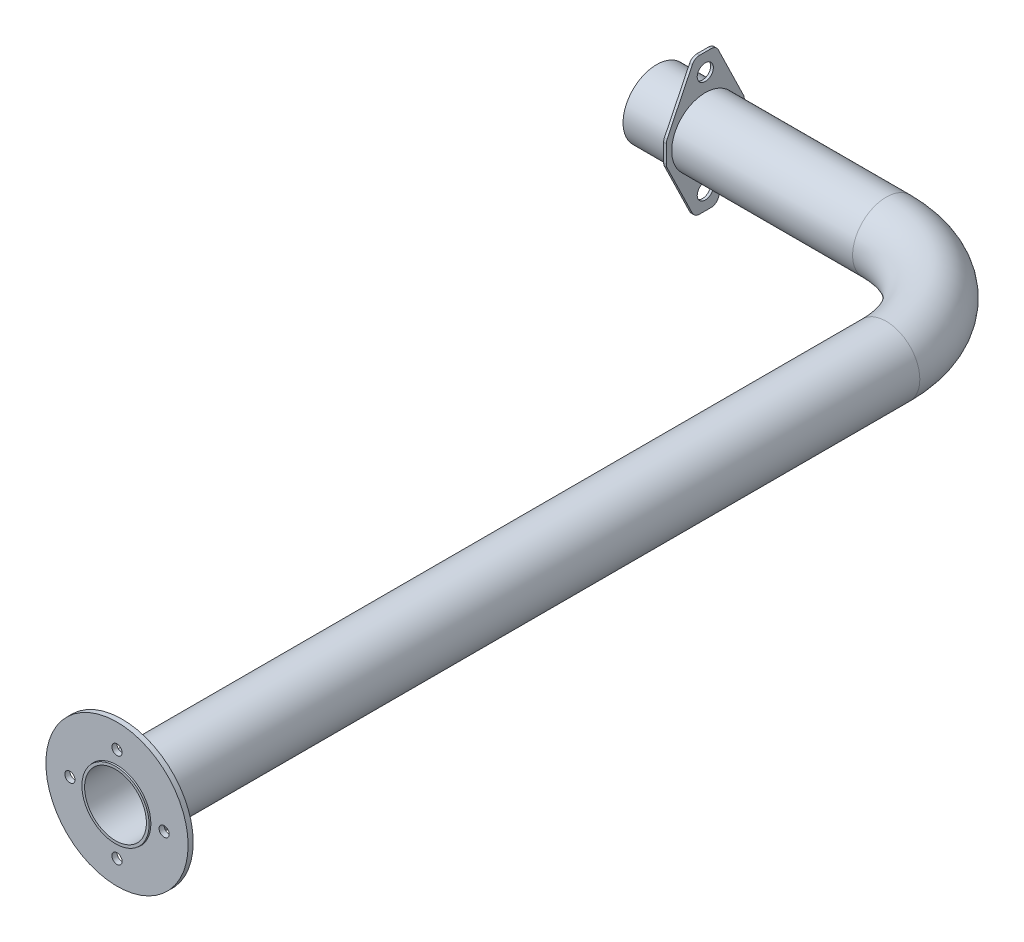
ISO-10303-21;
HEADER;
FILE_DESCRIPTION(('STEP AP214'),'2;1');
FILE_NAME('part.step','',(''),(''),'','','');
FILE_SCHEMA(('AUTOMOTIVE_DESIGN { 1 0 10303 214 1 1 1 1 }'));
ENDSEC;
DATA;
#1=APPLICATION_CONTEXT('core data for automotive mechanical design processes');
#2=APPLICATION_PROTOCOL_DEFINITION('international standard','automotive_design',2000,#1);
#3=PRODUCT_CONTEXT('',#1,'mechanical');
#4=PRODUCT('Part','Part','',(#3));
#5=PRODUCT_RELATED_PRODUCT_CATEGORY('part','',(#4));
#6=PRODUCT_DEFINITION_FORMATION('','',#4);
#7=PRODUCT_DEFINITION_CONTEXT('part definition',#1,'design');
#8=PRODUCT_DEFINITION('design','',#6,#7);
#9=PRODUCT_DEFINITION_SHAPE('','',#8);
#10=(LENGTH_UNIT() NAMED_UNIT(*) SI_UNIT(.MILLI.,.METRE.));
#11=(NAMED_UNIT(*) PLANE_ANGLE_UNIT() SI_UNIT($,.RADIAN.));
#12=(NAMED_UNIT(*) SI_UNIT($,.STERADIAN.) SOLID_ANGLE_UNIT());
#13=UNCERTAINTY_MEASURE_WITH_UNIT(LENGTH_MEASURE(1.E-05),#10,'distance_accuracy_value','');
#14=(GEOMETRIC_REPRESENTATION_CONTEXT(3) GLOBAL_UNCERTAINTY_ASSIGNED_CONTEXT((#13)) GLOBAL_UNIT_ASSIGNED_CONTEXT((#10,
#11,#12)) REPRESENTATION_CONTEXT('',''));
#15=CARTESIAN_POINT('',(0.,0.,0.));
#16=DIRECTION('',(0.,0.,1.));
#17=DIRECTION('',(1.,0.,0.));
#18=AXIS2_PLACEMENT_3D('',#15,#16,#17);
#19=CARTESIAN_POINT('',(-107.3,0.,-341.2));
#20=DIRECTION('',(0.,0.,1.));
#21=DIRECTION('',(1.,0.,0.));
#22=AXIS2_PLACEMENT_3D('',#19,#20,#21);
#23=PLANE('',#22);
#24=DIRECTION('',(0.,1.,0.));
#25=VECTOR('',#24,1.);
#26=CARTESIAN_POINT('',(-108.3,0.,-341.2));
#27=LINE('',#26,#25);
#28=CARTESIAN_POINT('',(-108.3,-3.30946597955697,-341.2));
#29=VERTEX_POINT('',#28);
#30=CARTESIAN_POINT('',(-108.3,3.30946597955698,-341.2));
#31=VERTEX_POINT('',#30);
#32=EDGE_CURVE('E209',#29,#31,#27,.T.);
#33=ORIENTED_EDGE('',*,*,#32,.T.);
#34=DIRECTION('',(-1.,0.,0.));
#35=VECTOR('',#34,1.);
#36=CARTESIAN_POINT('',(-107.3,3.30946597955698,-341.2));
#37=LINE('',#36,#35);
#38=CARTESIAN_POINT('',(-107.3,3.30946597955698,-341.2));
#39=VERTEX_POINT('',#38);
#40=EDGE_CURVE('E12',#39,#31,#37,.T.);
#41=ORIENTED_EDGE('',*,*,#40,.F.);
#42=DIRECTION('',(0.,1.,0.));
#43=VECTOR('',#42,1.);
#44=CARTESIAN_POINT('',(-107.3,0.,-341.2));
#45=LINE('',#44,#43);
#46=CARTESIAN_POINT('',(-107.3,-3.30946597955697,-341.2));
#47=VERTEX_POINT('',#46);
#48=EDGE_CURVE('E135',#47,#39,#45,.T.);
#49=ORIENTED_EDGE('',*,*,#48,.F.);
#50=DIRECTION('',(-1.,0.,0.));
#51=VECTOR('',#50,1.);
#52=CARTESIAN_POINT('',(-107.3,-3.30946597955697,-341.2));
#53=LINE('',#52,#51);
#54=EDGE_CURVE('E208',#47,#29,#53,.T.);
#55=ORIENTED_EDGE('',*,*,#54,.T.);
#56=EDGE_LOOP('',(#33,#41,#49,#55));
#57=FACE_BOUND('',#56,.T.);
#58=ADVANCED_FACE('F55',(#57),#23,.F.);
#59=CARTESIAN_POINT('',(-107.3,3.30946597955699,-338.2));
#60=DIRECTION('',(-1.,0.,0.));
#61=DIRECTION('',(0.,0.,1.));
#62=AXIS2_PLACEMENT_3D('',#59,#60,#61);
#63=CYLINDRICAL_SURFACE('',#62,3.);
#64=CARTESIAN_POINT('',(-108.3,3.30946597955699,-338.2));
#65=DIRECTION('',(1.,0.,0.));
#66=DIRECTION('',(0.,0.,-1.));
#67=AXIS2_PLACEMENT_3D('',#64,#65,#66);
#68=CIRCLE('',#67,3.);
#69=CARTESIAN_POINT('',(-108.3,4.6210441001753,-340.898103562415));
#70=VERTEX_POINT('',#69);
#71=EDGE_CURVE('E212',#70,#31,#68,.F.);
#72=ORIENTED_EDGE('',*,*,#71,.F.);
#73=DIRECTION('',(-1.,0.,0.));
#74=VECTOR('',#73,1.);
#75=CARTESIAN_POINT('',(-107.3,4.6210441001753,-340.898103562415));
#76=LINE('',#75,#74);
#77=CARTESIAN_POINT('',(-107.3,4.6210441001753,-340.898103562415));
#78=VERTEX_POINT('',#77);
#79=EDGE_CURVE('E63',#78,#70,#76,.T.);
#80=ORIENTED_EDGE('',*,*,#79,.F.);
#81=CARTESIAN_POINT('',(-107.3,3.30946597955699,-338.2));
#82=DIRECTION('',(1.,0.,0.));
#83=DIRECTION('',(0.,0.,-1.));
#84=AXIS2_PLACEMENT_3D('',#81,#82,#83);
#85=CIRCLE('',#84,3.);
#86=EDGE_CURVE('E305',#78,#39,#85,.F.);
#87=ORIENTED_EDGE('',*,*,#86,.T.);
#88=ORIENTED_EDGE('',*,*,#40,.T.);
#89=EDGE_LOOP('',(#72,#80,#87,#88));
#90=FACE_BOUND('',#89,.T.);
#91=ADVANCED_FACE('F290',(#90),#63,.T.);
#92=CARTESIAN_POINT('',(-107.3,134.923388984241,-277.556685910438));
#93=DIRECTION('',(0.,0.437192706872768,-0.899367854138262));
#94=DIRECTION('',(0.,0.899367854138262,0.437192706872768));
#95=AXIS2_PLACEMENT_3D('',#92,#93,#94);
#96=PLANE('',#95);
#97=DIRECTION('',(0.,-0.899367854138262,-0.437192706872768));
#98=VECTOR('',#97,1.);
#99=CARTESIAN_POINT('',(-108.3,134.923388984241,-277.556685910438));
#100=LINE('',#99,#98);
#101=CARTESIAN_POINT('',(-108.3,23.9115781206183,-331.520760635811));
#102=VERTEX_POINT('',#101);
#103=EDGE_CURVE('E215',#102,#70,#100,.T.);
#104=ORIENTED_EDGE('',*,*,#103,.F.);
#105=DIRECTION('',(-1.,0.,0.));
#106=VECTOR('',#105,1.);
#107=CARTESIAN_POINT('',(-107.3,23.9115781206183,-331.520760635811));
#108=LINE('',#107,#106);
#109=CARTESIAN_POINT('',(-107.3,23.9115781206183,-331.520760635811));
#110=VERTEX_POINT('',#109);
#111=EDGE_CURVE('E280',#110,#102,#108,.T.);
#112=ORIENTED_EDGE('',*,*,#111,.F.);
#113=DIRECTION('',(0.,-0.899367854138262,-0.437192706872768));
#114=VECTOR('',#113,1.);
#115=CARTESIAN_POINT('',(-107.3,134.923388984241,-277.556685910438));
#116=LINE('',#115,#114);
#117=EDGE_CURVE('E287',#110,#78,#116,.T.);
#118=ORIENTED_EDGE('',*,*,#117,.T.);
#119=ORIENTED_EDGE('',*,*,#79,.T.);
#120=EDGE_LOOP('',(#104,#112,#118,#119));
#121=FACE_BOUND('',#120,.T.);
#122=ADVANCED_FACE('F285',(#121),#96,.T.);
#123=CARTESIAN_POINT('',(-107.3,22.6,-328.822657073396));
#124=DIRECTION('',(-1.,0.,0.));
#125=DIRECTION('',(0.,0.,1.));
#126=AXIS2_PLACEMENT_3D('',#123,#124,#125);
#127=CYLINDRICAL_SURFACE('',#126,3.);
#128=CARTESIAN_POINT('',(-108.3,22.6,-328.822657073396));
#129=DIRECTION('',(1.,0.,0.));
#130=DIRECTION('',(0.,0.,-1.));
#131=AXIS2_PLACEMENT_3D('',#128,#129,#130);
#132=CIRCLE('',#131,3.);
#133=CARTESIAN_POINT('',(-108.3,25.6,-328.822657073396));
#134=VERTEX_POINT('',#133);
#135=EDGE_CURVE('E218',#134,#102,#132,.F.);
#136=ORIENTED_EDGE('',*,*,#135,.F.);
#137=DIRECTION('',(-1.,0.,0.));
#138=VECTOR('',#137,1.);
#139=CARTESIAN_POINT('',(-107.3,25.6,-328.822657073396));
#140=LINE('',#139,#138);
#141=CARTESIAN_POINT('',(-107.3,25.6,-328.822657073396));
#142=VERTEX_POINT('',#141);
#143=EDGE_CURVE('E278',#142,#134,#140,.T.);
#144=ORIENTED_EDGE('',*,*,#143,.F.);
#145=CARTESIAN_POINT('',(-107.3,22.6,-328.822657073396));
#146=DIRECTION('',(1.,0.,0.));
#147=DIRECTION('',(0.,0.,-1.));
#148=AXIS2_PLACEMENT_3D('',#145,#146,#147);
#149=CIRCLE('',#148,3.);
#150=EDGE_CURVE('E302',#142,#110,#149,.F.);
#151=ORIENTED_EDGE('',*,*,#150,.T.);
#152=ORIENTED_EDGE('',*,*,#111,.T.);
#153=EDGE_LOOP('',(#136,#144,#151,#152));
#154=FACE_BOUND('',#153,.T.);
#155=ADVANCED_FACE('F299',(#154),#127,.T.);
#156=CARTESIAN_POINT('',(-107.3,25.6,0.));
#157=DIRECTION('',(0.,1.,0.));
#158=DIRECTION('',(0.,0.,1.));
#159=AXIS2_PLACEMENT_3D('',#156,#157,#158);
#160=PLANE('',#159);
#161=DIRECTION('',(0.,0.,-1.));
#162=VECTOR('',#161,1.);
#163=CARTESIAN_POINT('',(-108.3,25.6,0.));
#164=LINE('',#163,#162);
#165=CARTESIAN_POINT('',(-108.3,25.6,-324.577342926604));
#166=VERTEX_POINT('',#165);
#167=EDGE_CURVE('E221',#166,#134,#164,.T.);
#168=ORIENTED_EDGE('',*,*,#167,.F.);
#169=DIRECTION('',(-1.,0.,0.));
#170=VECTOR('',#169,1.);
#171=CARTESIAN_POINT('',(-107.3,25.6,-324.577342926604));
#172=LINE('',#171,#170);
#173=CARTESIAN_POINT('',(-107.3,25.6,-324.577342926604));
#174=VERTEX_POINT('',#173);
#175=EDGE_CURVE('E276',#174,#166,#172,.T.);
#176=ORIENTED_EDGE('',*,*,#175,.F.);
#177=DIRECTION('',(0.,0.,-1.));
#178=VECTOR('',#177,1.);
#179=CARTESIAN_POINT('',(-107.3,25.6,0.));
#180=LINE('',#179,#178);
#181=EDGE_CURVE('E307',#174,#142,#180,.T.);
#182=ORIENTED_EDGE('',*,*,#181,.T.);
#183=ORIENTED_EDGE('',*,*,#143,.T.);
#184=EDGE_LOOP('',(#168,#176,#182,#183));
#185=FACE_BOUND('',#184,.T.);
#186=ADVANCED_FACE('F520',(#185),#160,.T.);
#187=CARTESIAN_POINT('',(-107.3,22.6,-324.577342926604));
#188=DIRECTION('',(-1.,0.,0.));
#189=DIRECTION('',(0.,0.,1.));
#190=AXIS2_PLACEMENT_3D('',#187,#188,#189);
#191=CYLINDRICAL_SURFACE('',#190,3.);
#192=CARTESIAN_POINT('',(-108.3,22.6,-324.577342926604));
#193=DIRECTION('',(1.,0.,0.));
#194=DIRECTION('',(0.,0.,-1.));
#195=AXIS2_PLACEMENT_3D('',#192,#193,#194);
#196=CIRCLE('',#195,3.);
#197=CARTESIAN_POINT('',(-108.3,23.9115781206183,-321.87923936419));
#198=VERTEX_POINT('',#197);
#199=EDGE_CURVE('E224',#166,#198,#196,.T.);
#200=ORIENTED_EDGE('',*,*,#199,.T.);
#201=DIRECTION('',(-1.,0.,0.));
#202=VECTOR('',#201,1.);
#203=CARTESIAN_POINT('',(-107.3,23.9115781206183,-321.87923936419));
#204=LINE('',#203,#202);
#205=CARTESIAN_POINT('',(-107.3,23.9115781206183,-321.87923936419));
#206=VERTEX_POINT('',#205);
#207=EDGE_CURVE('E273',#206,#198,#204,.T.);
#208=ORIENTED_EDGE('',*,*,#207,.F.);
#209=CARTESIAN_POINT('',(-107.3,22.6,-324.577342926604));
#210=DIRECTION('',(1.,0.,0.));
#211=DIRECTION('',(0.,0.,-1.));
#212=AXIS2_PLACEMENT_3D('',#209,#210,#211);
#213=CIRCLE('',#212,3.);
#214=EDGE_CURVE('E313',#174,#206,#213,.T.);
#215=ORIENTED_EDGE('',*,*,#214,.F.);
#216=ORIENTED_EDGE('',*,*,#175,.T.);
#217=EDGE_LOOP('',(#200,#208,#215,#216));
#218=FACE_BOUND('',#217,.T.);
#219=ADVANCED_FACE('F509',(#218),#191,.T.);
#220=CARTESIAN_POINT('',(-107.3,-121.991574348573,-250.954095802777));
#221=DIRECTION('',(0.,-0.437192706872768,-0.899367854138262));
#222=DIRECTION('',(0.,0.899367854138262,-0.437192706872768));
#223=AXIS2_PLACEMENT_3D('',#220,#221,#222);
#224=PLANE('',#223);
#225=DIRECTION('',(0.,-0.899367854138262,0.437192706872768));
#226=VECTOR('',#225,1.);
#227=CARTESIAN_POINT('',(-108.3,-121.991574348573,-250.954095802777));
#228=LINE('',#227,#226);
#229=CARTESIAN_POINT('',(-108.3,4.6210441001753,-312.501896437585));
#230=VERTEX_POINT('',#229);
#231=EDGE_CURVE('E226',#198,#230,#228,.T.);
#232=ORIENTED_EDGE('',*,*,#231,.T.);
#233=DIRECTION('',(-1.,0.,0.));
#234=VECTOR('',#233,1.);
#235=CARTESIAN_POINT('',(-107.3,4.6210441001753,-312.501896437585));
#236=LINE('',#235,#234);
#237=CARTESIAN_POINT('',(-107.3,4.6210441001753,-312.501896437585));
#238=VERTEX_POINT('',#237);
#239=EDGE_CURVE('E270',#238,#230,#236,.T.);
#240=ORIENTED_EDGE('',*,*,#239,.F.);
#241=DIRECTION('',(0.,-0.899367854138262,0.437192706872768));
#242=VECTOR('',#241,1.);
#243=CARTESIAN_POINT('',(-107.3,-121.991574348573,-250.954095802777));
#244=LINE('',#243,#242);
#245=EDGE_CURVE('E315',#206,#238,#244,.T.);
#246=ORIENTED_EDGE('',*,*,#245,.F.);
#247=ORIENTED_EDGE('',*,*,#207,.T.);
#248=EDGE_LOOP('',(#232,#240,#246,#247));
#249=FACE_BOUND('',#248,.T.);
#250=ADVANCED_FACE('F498',(#249),#224,.F.);
#251=CARTESIAN_POINT('',(-107.3,3.30946597955699,-315.2));
#252=DIRECTION('',(-1.,0.,0.));
#253=DIRECTION('',(0.,0.,1.));
#254=AXIS2_PLACEMENT_3D('',#251,#252,#253);
#255=CYLINDRICAL_SURFACE('',#254,3.);
#256=CARTESIAN_POINT('',(-108.3,3.30946597955699,-315.2));
#257=DIRECTION('',(1.,0.,0.));
#258=DIRECTION('',(0.,0.,-1.));
#259=AXIS2_PLACEMENT_3D('',#256,#257,#258);
#260=CIRCLE('',#259,3.);
#261=CARTESIAN_POINT('',(-108.3,3.30946597955698,-312.2));
#262=VERTEX_POINT('',#261);
#263=EDGE_CURVE('E228',#230,#262,#260,.T.);
#264=ORIENTED_EDGE('',*,*,#263,.T.);
#265=DIRECTION('',(-1.,0.,0.));
#266=VECTOR('',#265,1.);
#267=CARTESIAN_POINT('',(-107.3,3.30946597955698,-312.2));
#268=LINE('',#267,#266);
#269=CARTESIAN_POINT('',(-107.3,3.30946597955698,-312.2));
#270=VERTEX_POINT('',#269);
#271=EDGE_CURVE('E268',#270,#262,#268,.T.);
#272=ORIENTED_EDGE('',*,*,#271,.F.);
#273=CARTESIAN_POINT('',(-107.3,3.30946597955699,-315.2));
#274=DIRECTION('',(1.,0.,0.));
#275=DIRECTION('',(0.,0.,-1.));
#276=AXIS2_PLACEMENT_3D('',#273,#274,#275);
#277=CIRCLE('',#276,3.);
#278=EDGE_CURVE('E317',#238,#270,#277,.T.);
#279=ORIENTED_EDGE('',*,*,#278,.F.);
#280=ORIENTED_EDGE('',*,*,#239,.T.);
#281=EDGE_LOOP('',(#264,#272,#279,#280));
#282=FACE_BOUND('',#281,.T.);
#283=ADVANCED_FACE('F487',(#282),#255,.T.);
#284=CARTESIAN_POINT('',(-107.3,0.,-312.2));
#285=DIRECTION('',(0.,0.,1.));
#286=DIRECTION('',(1.,0.,0.));
#287=AXIS2_PLACEMENT_3D('',#284,#285,#286);
#288=PLANE('',#287);
#289=DIRECTION('',(0.,1.,0.));
#290=VECTOR('',#289,1.);
#291=CARTESIAN_POINT('',(-108.3,0.,-312.2));
#292=LINE('',#291,#290);
#293=CARTESIAN_POINT('',(-108.3,-3.30946597955697,-312.2));
#294=VERTEX_POINT('',#293);
#295=EDGE_CURVE('E231',#294,#262,#292,.T.);
#296=ORIENTED_EDGE('',*,*,#295,.F.);
#297=DIRECTION('',(-1.,0.,0.));
#298=VECTOR('',#297,1.);
#299=CARTESIAN_POINT('',(-107.3,-3.30946597955697,-312.2));
#300=LINE('',#299,#298);
#301=CARTESIAN_POINT('',(-107.3,-3.30946597955697,-312.2));
#302=VERTEX_POINT('',#301);
#303=EDGE_CURVE('E266',#302,#294,#300,.T.);
#304=ORIENTED_EDGE('',*,*,#303,.F.);
#305=DIRECTION('',(0.,1.,0.));
#306=VECTOR('',#305,1.);
#307=CARTESIAN_POINT('',(-107.3,0.,-312.2));
#308=LINE('',#307,#306);
#309=EDGE_CURVE('E319',#302,#270,#308,.T.);
#310=ORIENTED_EDGE('',*,*,#309,.T.);
#311=ORIENTED_EDGE('',*,*,#271,.T.);
#312=EDGE_LOOP('',(#296,#304,#310,#311));
#313=FACE_BOUND('',#312,.T.);
#314=ADVANCED_FACE('F476',(#313),#288,.T.);
#315=CARTESIAN_POINT('',(-107.3,-3.30946597955699,-315.2));
#316=DIRECTION('',(-1.,0.,0.));
#317=DIRECTION('',(0.,0.,1.));
#318=AXIS2_PLACEMENT_3D('',#315,#316,#317);
#319=CYLINDRICAL_SURFACE('',#318,3.00000000000003);
#320=CARTESIAN_POINT('',(-108.3,-3.30946597955699,-315.2));
#321=DIRECTION('',(1.,0.,0.));
#322=DIRECTION('',(0.,0.,-1.));
#323=AXIS2_PLACEMENT_3D('',#320,#321,#322);
#324=CIRCLE('',#323,3.00000000000003);
#325=CARTESIAN_POINT('',(-108.3,-4.62104410017533,-312.501896437585));
#326=VERTEX_POINT('',#325);
#327=EDGE_CURVE('E234',#326,#294,#324,.F.);
#328=ORIENTED_EDGE('',*,*,#327,.F.);
#329=DIRECTION('',(-1.,0.,0.));
#330=VECTOR('',#329,1.);
#331=CARTESIAN_POINT('',(-107.3,-4.62104410017533,-312.501896437585));
#332=LINE('',#331,#330);
#333=CARTESIAN_POINT('',(-107.3,-4.62104410017533,-312.501896437585));
#334=VERTEX_POINT('',#333);
#335=EDGE_CURVE('E264',#334,#326,#332,.T.);
#336=ORIENTED_EDGE('',*,*,#335,.F.);
#337=CARTESIAN_POINT('',(-107.3,-3.30946597955699,-315.2));
#338=DIRECTION('',(1.,0.,0.));
#339=DIRECTION('',(0.,0.,-1.));
#340=AXIS2_PLACEMENT_3D('',#337,#338,#339);
#341=CIRCLE('',#340,3.00000000000003);
#342=EDGE_CURVE('E322',#334,#302,#341,.F.);
#343=ORIENTED_EDGE('',*,*,#342,.T.);
#344=ORIENTED_EDGE('',*,*,#303,.T.);
#345=EDGE_LOOP('',(#328,#336,#343,#344));
#346=FACE_BOUND('',#345,.T.);
#347=ADVANCED_FACE('F466',(#346),#319,.T.);
#348=CARTESIAN_POINT('',(-107.3,121.991574348573,-250.954095802777));
#349=DIRECTION('',(0.,-0.437192706872768,0.899367854138262));
#350=DIRECTION('',(0.,-0.899367854138262,-0.437192706872768));
#351=AXIS2_PLACEMENT_3D('',#348,#349,#350);
#352=PLANE('',#351);
#353=DIRECTION('',(0.,0.899367854138262,0.437192706872768));
#354=VECTOR('',#353,1.);
#355=CARTESIAN_POINT('',(-108.3,121.991574348573,-250.954095802777));
#356=LINE('',#355,#354);
#357=CARTESIAN_POINT('',(-108.3,-23.9115781206183,-321.879239364189));
#358=VERTEX_POINT('',#357);
#359=EDGE_CURVE('E237',#358,#326,#356,.T.);
#360=ORIENTED_EDGE('',*,*,#359,.F.);
#361=DIRECTION('',(-1.,0.,0.));
#362=VECTOR('',#361,1.);
#363=CARTESIAN_POINT('',(-107.3,-23.9115781206183,-321.879239364189));
#364=LINE('',#363,#362);
#365=CARTESIAN_POINT('',(-107.3,-23.9115781206183,-321.879239364189));
#366=VERTEX_POINT('',#365);
#367=EDGE_CURVE('E262',#366,#358,#364,.T.);
#368=ORIENTED_EDGE('',*,*,#367,.F.);
#369=DIRECTION('',(0.,0.899367854138262,0.437192706872768));
#370=VECTOR('',#369,1.);
#371=CARTESIAN_POINT('',(-107.3,121.991574348573,-250.954095802777));
#372=LINE('',#371,#370);
#373=EDGE_CURVE('E325',#366,#334,#372,.T.);
#374=ORIENTED_EDGE('',*,*,#373,.T.);
#375=ORIENTED_EDGE('',*,*,#335,.T.);
#376=EDGE_LOOP('',(#360,#368,#374,#375));
#377=FACE_BOUND('',#376,.T.);
#378=ADVANCED_FACE('F338',(#377),#352,.T.);
#379=CARTESIAN_POINT('',(-107.3,-22.6,-324.577342926604));
#380=DIRECTION('',(-1.,0.,0.));
#381=DIRECTION('',(0.,0.,1.));
#382=AXIS2_PLACEMENT_3D('',#379,#380,#381);
#383=CYLINDRICAL_SURFACE('',#382,3.);
#384=CARTESIAN_POINT('',(-108.3,-22.6,-324.577342926604));
#385=DIRECTION('',(1.,0.,0.));
#386=DIRECTION('',(0.,0.,-1.));
#387=AXIS2_PLACEMENT_3D('',#384,#385,#386);
#388=CIRCLE('',#387,3.);
#389=CARTESIAN_POINT('',(-108.3,-25.6,-324.577342926604));
#390=VERTEX_POINT('',#389);
#391=EDGE_CURVE('E240',#390,#358,#388,.F.);
#392=ORIENTED_EDGE('',*,*,#391,.F.);
#393=DIRECTION('',(-1.,0.,0.));
#394=VECTOR('',#393,1.);
#395=CARTESIAN_POINT('',(-107.3,-25.6,-324.577342926604));
#396=LINE('',#395,#394);
#397=CARTESIAN_POINT('',(-107.3,-25.6,-324.577342926604));
#398=VERTEX_POINT('',#397);
#399=EDGE_CURVE('E260',#398,#390,#396,.T.);
#400=ORIENTED_EDGE('',*,*,#399,.F.);
#401=CARTESIAN_POINT('',(-107.3,-22.6,-324.577342926604));
#402=DIRECTION('',(1.,0.,0.));
#403=DIRECTION('',(0.,0.,-1.));
#404=AXIS2_PLACEMENT_3D('',#401,#402,#403);
#405=CIRCLE('',#404,3.);
#406=EDGE_CURVE('E328',#398,#366,#405,.F.);
#407=ORIENTED_EDGE('',*,*,#406,.T.);
#408=ORIENTED_EDGE('',*,*,#367,.T.);
#409=EDGE_LOOP('',(#392,#400,#407,#408));
#410=FACE_BOUND('',#409,.T.);
#411=ADVANCED_FACE('F332',(#410),#383,.T.);
#412=CARTESIAN_POINT('',(-107.3,-25.6,0.));
#413=DIRECTION('',(0.,1.,0.));
#414=DIRECTION('',(0.,0.,1.));
#415=AXIS2_PLACEMENT_3D('',#412,#413,#414);
#416=PLANE('',#415);
#417=DIRECTION('',(0.,0.,-1.));
#418=VECTOR('',#417,1.);
#419=CARTESIAN_POINT('',(-108.3,-25.6,0.));
#420=LINE('',#419,#418);
#421=CARTESIAN_POINT('',(-108.3,-25.6,-328.822657073396));
#422=VERTEX_POINT('',#421);
#423=EDGE_CURVE('E243',#390,#422,#420,.T.);
#424=ORIENTED_EDGE('',*,*,#423,.T.);
#425=DIRECTION('',(-1.,0.,0.));
#426=VECTOR('',#425,1.);
#427=CARTESIAN_POINT('',(-107.3,-25.6,-328.822657073396));
#428=LINE('',#427,#426);
#429=CARTESIAN_POINT('',(-107.3,-25.6,-328.822657073396));
#430=VERTEX_POINT('',#429);
#431=EDGE_CURVE('E191',#430,#422,#428,.T.);
#432=ORIENTED_EDGE('',*,*,#431,.F.);
#433=DIRECTION('',(0.,0.,-1.));
#434=VECTOR('',#433,1.);
#435=CARTESIAN_POINT('',(-107.3,-25.6,0.));
#436=LINE('',#435,#434);
#437=EDGE_CURVE('E182',#398,#430,#436,.T.);
#438=ORIENTED_EDGE('',*,*,#437,.F.);
#439=ORIENTED_EDGE('',*,*,#399,.T.);
#440=EDGE_LOOP('',(#424,#432,#438,#439));
#441=FACE_BOUND('',#440,.T.);
#442=ADVANCED_FACE('F342',(#441),#416,.F.);
#443=CARTESIAN_POINT('',(-107.3,-22.6,-328.822657073396));
#444=DIRECTION('',(-1.,0.,0.));
#445=DIRECTION('',(0.,0.,1.));
#446=AXIS2_PLACEMENT_3D('',#443,#444,#445);
#447=CYLINDRICAL_SURFACE('',#446,3.);
#448=CARTESIAN_POINT('',(-108.3,-22.6,-328.822657073396));
#449=DIRECTION('',(1.,0.,0.));
#450=DIRECTION('',(0.,0.,-1.));
#451=AXIS2_PLACEMENT_3D('',#448,#449,#450);
#452=CIRCLE('',#451,3.);
#453=CARTESIAN_POINT('',(-108.3,-23.9115781206183,-331.520760635811));
#454=VERTEX_POINT('',#453);
#455=EDGE_CURVE('E190',#422,#454,#452,.T.);
#456=ORIENTED_EDGE('',*,*,#455,.T.);
#457=DIRECTION('',(-1.,0.,0.));
#458=VECTOR('',#457,1.);
#459=CARTESIAN_POINT('',(-107.3,-23.9115781206183,-331.520760635811));
#460=LINE('',#459,#458);
#461=CARTESIAN_POINT('',(-107.3,-23.9115781206183,-331.520760635811));
#462=VERTEX_POINT('',#461);
#463=EDGE_CURVE('E187',#462,#454,#460,.T.);
#464=ORIENTED_EDGE('',*,*,#463,.F.);
#465=CARTESIAN_POINT('',(-107.3,-22.6,-328.822657073396));
#466=DIRECTION('',(1.,0.,0.));
#467=DIRECTION('',(0.,0.,-1.));
#468=AXIS2_PLACEMENT_3D('',#465,#466,#467);
#469=CIRCLE('',#468,3.);
#470=EDGE_CURVE('E174',#430,#462,#469,.T.);
#471=ORIENTED_EDGE('',*,*,#470,.F.);
#472=ORIENTED_EDGE('',*,*,#431,.T.);
#473=EDGE_LOOP('',(#456,#464,#471,#472));
#474=FACE_BOUND('',#473,.T.);
#475=ADVANCED_FACE('F188',(#474),#447,.T.);
#476=CARTESIAN_POINT('',(-107.3,-134.923388984241,-277.556685910438));
#477=DIRECTION('',(0.,0.437192706872768,0.899367854138262));
#478=DIRECTION('',(0.,-0.899367854138262,0.437192706872768));
#479=AXIS2_PLACEMENT_3D('',#476,#477,#478);
#480=PLANE('',#479);
#481=DIRECTION('',(0.,0.899367854138262,-0.437192706872768));
#482=VECTOR('',#481,1.);
#483=CARTESIAN_POINT('',(-108.3,-134.923388984241,-277.556685910438));
#484=LINE('',#483,#482);
#485=CARTESIAN_POINT('',(-108.3,-4.62104410017533,-340.898103562415));
#486=VERTEX_POINT('',#485);
#487=EDGE_CURVE('E123',#454,#486,#484,.T.);
#488=ORIENTED_EDGE('',*,*,#487,.T.);
#489=DIRECTION('',(-1.,0.,0.));
#490=VECTOR('',#489,1.);
#491=CARTESIAN_POINT('',(-107.3,-4.62104410017533,-340.898103562415));
#492=LINE('',#491,#490);
#493=CARTESIAN_POINT('',(-107.3,-4.62104410017533,-340.898103562415));
#494=VERTEX_POINT('',#493);
#495=EDGE_CURVE('E192',#494,#486,#492,.T.);
#496=ORIENTED_EDGE('',*,*,#495,.F.);
#497=DIRECTION('',(0.,0.899367854138262,-0.437192706872768));
#498=VECTOR('',#497,1.);
#499=CARTESIAN_POINT('',(-107.3,-134.923388984241,-277.556685910438));
#500=LINE('',#499,#498);
#501=EDGE_CURVE('E179',#462,#494,#500,.T.);
#502=ORIENTED_EDGE('',*,*,#501,.F.);
#503=ORIENTED_EDGE('',*,*,#463,.T.);
#504=EDGE_LOOP('',(#488,#496,#502,#503));
#505=FACE_BOUND('',#504,.T.);
#506=ADVANCED_FACE('F194',(#505),#480,.F.);
#507=CARTESIAN_POINT('',(-107.3,0.,-326.7));
#508=DIRECTION('',(-1.,0.,0.));
#509=DIRECTION('',(0.,0.,1.));
#510=AXIS2_PLACEMENT_3D('',#507,#508,#509);
#511=CYLINDRICAL_SURFACE('',#510,11.5);
#512=CARTESIAN_POINT('',(-107.3,0.,-326.7));
#513=DIRECTION('',(1.,0.,0.));
#514=DIRECTION('',(0.,0.,-1.));
#515=AXIS2_PLACEMENT_3D('',#512,#513,#514);
#516=CIRCLE('',#515,11.5);
#517=CARTESIAN_POINT('',(-107.3,0.,-338.2));
#518=VERTEX_POINT('',#517);
#519=EDGE_CURVE('E202',#518,#518,#516,.T.);
#520=ORIENTED_EDGE('',*,*,#519,.T.);
#521=EDGE_LOOP('',(#520));
#522=FACE_BOUND('',#521,.T.);
#523=CARTESIAN_POINT('',(-108.3,0.,-326.7));
#524=DIRECTION('',(1.,0.,0.));
#525=DIRECTION('',(0.,0.,-1.));
#526=AXIS2_PLACEMENT_3D('',#523,#524,#525);
#527=CIRCLE('',#526,11.5);
#528=CARTESIAN_POINT('',(-108.3,0.,-338.2));
#529=VERTEX_POINT('',#528);
#530=EDGE_CURVE('E251',#529,#529,#527,.T.);
#531=ORIENTED_EDGE('',*,*,#530,.F.);
#532=EDGE_LOOP('',(#531));
#533=FACE_BOUND('',#532,.T.);
#534=ADVANCED_FACE('F367',(#522,#533),#511,.F.);
#535=CARTESIAN_POINT('',(-107.3,19.1,-326.7));
#536=DIRECTION('',(-1.,0.,0.));
#537=DIRECTION('',(0.,0.,1.));
#538=AXIS2_PLACEMENT_3D('',#535,#536,#537);
#539=CYLINDRICAL_SURFACE('',#538,2.99999999999999);
#540=CARTESIAN_POINT('',(-107.3,19.1,-326.7));
#541=DIRECTION('',(1.,0.,0.));
#542=DIRECTION('',(0.,0.,-1.));
#543=AXIS2_PLACEMENT_3D('',#540,#541,#542);
#544=CIRCLE('',#543,2.99999999999999);
#545=CARTESIAN_POINT('',(-107.3,19.1,-329.7));
#546=VERTEX_POINT('',#545);
#547=EDGE_CURVE('E196',#546,#546,#544,.T.);
#548=ORIENTED_EDGE('',*,*,#547,.T.);
#549=EDGE_LOOP('',(#548));
#550=FACE_BOUND('',#549,.T.);
#551=CARTESIAN_POINT('',(-108.3,19.1,-326.7));
#552=DIRECTION('',(1.,0.,0.));
#553=DIRECTION('',(0.,0.,-1.));
#554=AXIS2_PLACEMENT_3D('',#551,#552,#553);
#555=CIRCLE('',#554,2.99999999999999);
#556=CARTESIAN_POINT('',(-108.3,19.1,-329.7));
#557=VERTEX_POINT('',#556);
#558=EDGE_CURVE('E248',#557,#557,#555,.T.);
#559=ORIENTED_EDGE('',*,*,#558,.F.);
#560=EDGE_LOOP('',(#559));
#561=FACE_BOUND('',#560,.T.);
#562=ADVANCED_FACE('F359',(#550,#561),#539,.F.);
#563=CARTESIAN_POINT('',(-107.3,-3.30946597955699,-338.2));
#564=DIRECTION('',(-1.,0.,0.));
#565=DIRECTION('',(0.,0.,1.));
#566=AXIS2_PLACEMENT_3D('',#563,#564,#565);
#567=CYLINDRICAL_SURFACE('',#566,3.00000000000003);
#568=CARTESIAN_POINT('',(-108.3,-3.30946597955699,-338.2));
#569=DIRECTION('',(1.,0.,0.));
#570=DIRECTION('',(0.,0.,-1.));
#571=AXIS2_PLACEMENT_3D('',#568,#569,#570);
#572=CIRCLE('',#571,3.00000000000003);
#573=EDGE_CURVE('E129',#486,#29,#572,.T.);
#574=ORIENTED_EDGE('',*,*,#573,.T.);
#575=ORIENTED_EDGE('',*,*,#54,.F.);
#576=CARTESIAN_POINT('',(-107.3,-3.30946597955699,-338.2));
#577=DIRECTION('',(1.,0.,0.));
#578=DIRECTION('',(0.,0.,-1.));
#579=AXIS2_PLACEMENT_3D('',#576,#577,#578);
#580=CIRCLE('',#579,3.00000000000003);
#581=EDGE_CURVE('E71',#494,#47,#580,.T.);
#582=ORIENTED_EDGE('',*,*,#581,.F.);
#583=ORIENTED_EDGE('',*,*,#495,.T.);
#584=EDGE_LOOP('',(#574,#575,#582,#583));
#585=FACE_BOUND('',#584,.T.);
#586=ADVANCED_FACE('F356',(#585),#567,.T.);
#587=CARTESIAN_POINT('',(-107.3,-19.1,-326.7));
#588=DIRECTION('',(-1.,0.,0.));
#589=DIRECTION('',(0.,0.,1.));
#590=AXIS2_PLACEMENT_3D('',#587,#588,#589);
#591=CYLINDRICAL_SURFACE('',#590,2.99999999999999);
#592=CARTESIAN_POINT('',(-107.3,-19.1,-326.7));
#593=DIRECTION('',(1.,0.,0.));
#594=DIRECTION('',(0.,0.,-1.));
#595=AXIS2_PLACEMENT_3D('',#592,#593,#594);
#596=CIRCLE('',#595,2.99999999999999);
#597=CARTESIAN_POINT('',(-107.3,-19.1,-329.7));
#598=VERTEX_POINT('',#597);
#599=EDGE_CURVE('E205',#598,#598,#596,.F.);
#600=ORIENTED_EDGE('',*,*,#599,.F.);
#601=EDGE_LOOP('',(#600));
#602=FACE_BOUND('',#601,.T.);
#603=CARTESIAN_POINT('',(-108.3,-19.1,-326.7));
#604=DIRECTION('',(1.,0.,0.));
#605=DIRECTION('',(0.,0.,-1.));
#606=AXIS2_PLACEMENT_3D('',#603,#604,#605);
#607=CIRCLE('',#606,2.99999999999999);
#608=CARTESIAN_POINT('',(-108.3,-19.1,-329.7));
#609=VERTEX_POINT('',#608);
#610=EDGE_CURVE('E254',#609,#609,#607,.F.);
#611=ORIENTED_EDGE('',*,*,#610,.T.);
#612=EDGE_LOOP('',(#611));
#613=FACE_BOUND('',#612,.T.);
#614=ADVANCED_FACE('F358',(#602,#613),#591,.F.);
#615=CARTESIAN_POINT('',(-107.3,0.,0.));
#616=DIRECTION('',(1.,0.,0.));
#617=DIRECTION('',(0.,0.,-1.));
#618=AXIS2_PLACEMENT_3D('',#615,#616,#617);
#619=PLANE('',#618);
#620=ORIENTED_EDGE('',*,*,#48,.T.);
#621=ORIENTED_EDGE('',*,*,#86,.F.);
#622=ORIENTED_EDGE('',*,*,#117,.F.);
#623=ORIENTED_EDGE('',*,*,#150,.F.);
#624=ORIENTED_EDGE('',*,*,#181,.F.);
#625=ORIENTED_EDGE('',*,*,#214,.T.);
#626=ORIENTED_EDGE('',*,*,#245,.T.);
#627=ORIENTED_EDGE('',*,*,#278,.T.);
#628=ORIENTED_EDGE('',*,*,#309,.F.);
#629=ORIENTED_EDGE('',*,*,#342,.F.);
#630=ORIENTED_EDGE('',*,*,#373,.F.);
#631=ORIENTED_EDGE('',*,*,#406,.F.);
#632=ORIENTED_EDGE('',*,*,#437,.T.);
#633=ORIENTED_EDGE('',*,*,#470,.T.);
#634=ORIENTED_EDGE('',*,*,#501,.T.);
#635=ORIENTED_EDGE('',*,*,#581,.T.);
#636=EDGE_LOOP('',(#620,#621,#622,#623,#624,#625,#626,#627,#628,#629,#630,#631,#632,#633,#634,#635));
#637=FACE_BOUND('',#636,.T.);
#638=ORIENTED_EDGE('',*,*,#547,.F.);
#639=EDGE_LOOP('',(#638));
#640=FACE_BOUND('',#639,.T.);
#641=ORIENTED_EDGE('',*,*,#519,.F.);
#642=EDGE_LOOP('',(#641));
#643=FACE_BOUND('',#642,.T.);
#644=ORIENTED_EDGE('',*,*,#599,.T.);
#645=EDGE_LOOP('',(#644));
#646=FACE_BOUND('',#645,.T.);
#647=ADVANCED_FACE('F176',(#637,#640,#643,#646),#619,.T.);
#648=CARTESIAN_POINT('',(-108.3,0.,0.));
#649=DIRECTION('',(1.,0.,0.));
#650=DIRECTION('',(0.,0.,-1.));
#651=AXIS2_PLACEMENT_3D('',#648,#649,#650);
#652=PLANE('',#651);
#653=ORIENTED_EDGE('',*,*,#32,.F.);
#654=ORIENTED_EDGE('',*,*,#573,.F.);
#655=ORIENTED_EDGE('',*,*,#487,.F.);
#656=ORIENTED_EDGE('',*,*,#455,.F.);
#657=ORIENTED_EDGE('',*,*,#423,.F.);
#658=ORIENTED_EDGE('',*,*,#391,.T.);
#659=ORIENTED_EDGE('',*,*,#359,.T.);
#660=ORIENTED_EDGE('',*,*,#327,.T.);
#661=ORIENTED_EDGE('',*,*,#295,.T.);
#662=ORIENTED_EDGE('',*,*,#263,.F.);
#663=ORIENTED_EDGE('',*,*,#231,.F.);
#664=ORIENTED_EDGE('',*,*,#199,.F.);
#665=ORIENTED_EDGE('',*,*,#167,.T.);
#666=ORIENTED_EDGE('',*,*,#135,.T.);
#667=ORIENTED_EDGE('',*,*,#103,.T.);
#668=ORIENTED_EDGE('',*,*,#71,.T.);
#669=EDGE_LOOP('',(#653,#654,#655,#656,#657,#658,#659,#660,#661,#662,#663,#664,#665,#666,#667,#668));
#670=FACE_BOUND('',#669,.T.);
#671=ORIENTED_EDGE('',*,*,#558,.T.);
#672=EDGE_LOOP('',(#671));
#673=FACE_BOUND('',#672,.T.);
#674=ORIENTED_EDGE('',*,*,#530,.T.);
#675=EDGE_LOOP('',(#674));
#676=FACE_BOUND('',#675,.T.);
#677=ORIENTED_EDGE('',*,*,#610,.F.);
#678=EDGE_LOOP('',(#677));
#679=FACE_BOUND('',#678,.T.);
#680=ADVANCED_FACE('F293',(#670,#673,#676,#679),#652,.F.);
#681=CLOSED_SHELL('',(#58,#91,#122,#155,#186,#219,#250,#283,#314,#347,#378,#411,#442,#475,#506,
#534,#562,#586,#614,#647,#680));
#682=MANIFOLD_SOLID_BREP('B2',#681);
#683=CARTESIAN_POINT('',(0.,0.,0.));
#684=DIRECTION('',(0.,0.,1.));
#685=DIRECTION('',(1.,0.,0.));
#686=AXIS2_PLACEMENT_3D('',#683,#684,#685);
#687=PLANE('',#686);
#688=CARTESIAN_POINT('',(0.,0.,0.));
#689=DIRECTION('',(0.,0.,1.));
#690=DIRECTION('',(1.,0.,0.));
#691=AXIS2_PLACEMENT_3D('',#688,#689,#690);
#692=CIRCLE('',#691,11.5);
#693=CARTESIAN_POINT('',(11.5,0.,0.));
#694=VERTEX_POINT('',#693);
#695=EDGE_CURVE('E648',#694,#694,#692,.T.);
#696=ORIENTED_EDGE('',*,*,#695,.F.);
#697=EDGE_LOOP('',(#696));
#698=FACE_BOUND('',#697,.T.);
#699=CARTESIAN_POINT('',(0.,0.,0.));
#700=DIRECTION('',(0.,0.,1.));
#701=DIRECTION('',(0.,-1.,0.));
#702=AXIS2_PLACEMENT_3D('',#699,#700,#701);
#703=CIRCLE('',#702,12.5);
#704=CARTESIAN_POINT('',(0.,-12.5,0.));
#705=VERTEX_POINT('',#704);
#706=EDGE_CURVE('E627',#705,#705,#703,.T.);
#707=ORIENTED_EDGE('',*,*,#706,.T.);
#708=EDGE_LOOP('',(#707));
#709=FACE_BOUND('',#708,.T.);
#710=ADVANCED_FACE('F608',(#698,#709),#687,.T.);
#711=CARTESIAN_POINT('',(-125.4,0.,-326.7));
#712=DIRECTION('',(1.,0.,0.));
#713=DIRECTION('',(0.,0.,-1.));
#714=AXIS2_PLACEMENT_3D('',#711,#712,#713);
#715=PLANE('',#714);
#716=CARTESIAN_POINT('',(-125.4,0.,-326.7));
#717=DIRECTION('',(1.,0.,0.));
#718=DIRECTION('',(0.,0.,-1.));
#719=AXIS2_PLACEMENT_3D('',#716,#717,#718);
#720=CIRCLE('',#719,11.5);
#721=CARTESIAN_POINT('',(-125.4,0.,-338.2));
#722=VERTEX_POINT('',#721);
#723=EDGE_CURVE('E632',#722,#722,#720,.T.);
#724=ORIENTED_EDGE('',*,*,#723,.T.);
#725=EDGE_LOOP('',(#724));
#726=FACE_BOUND('',#725,.T.);
#727=CARTESIAN_POINT('',(-125.4,0.,-326.7));
#728=DIRECTION('',(1.,0.,0.));
#729=DIRECTION('',(0.,0.,-1.));
#730=AXIS2_PLACEMENT_3D('',#727,#728,#729);
#731=CIRCLE('',#730,12.5);
#732=CARTESIAN_POINT('',(-125.4,0.,-339.2));
#733=VERTEX_POINT('',#732);
#734=EDGE_CURVE('E54',#733,#733,#731,.T.);
#735=ORIENTED_EDGE('',*,*,#734,.F.);
#736=EDGE_LOOP('',(#735));
#737=FACE_BOUND('',#736,.T.);
#738=ADVANCED_FACE('F656',(#726,#737),#715,.F.);
#739=CARTESIAN_POINT('',(0.,0.,0.));
#740=DIRECTION('',(0.,0.,-1.));
#741=DIRECTION('',(-1.,0.,0.));
#742=AXIS2_PLACEMENT_3D('',#739,#740,#741);
#743=CYLINDRICAL_SURFACE('',#742,12.5);
#744=CARTESIAN_POINT('',(0.,0.,-286.7));
#745=DIRECTION('',(0.,0.,-1.));
#746=DIRECTION('',(-1.,0.,0.));
#747=AXIS2_PLACEMENT_3D('',#744,#745,#746);
#748=CIRCLE('',#747,12.5);
#749=CARTESIAN_POINT('',(12.5,0.,-286.7));
#750=VERTEX_POINT('',#749);
#751=EDGE_CURVE('E621',#750,#750,#748,.F.);
#752=ORIENTED_EDGE('',*,*,#751,.T.);
#753=EDGE_LOOP('',(#752));
#754=FACE_BOUND('',#753,.T.);
#755=ORIENTED_EDGE('',*,*,#706,.F.);
#756=EDGE_LOOP('',(#755));
#757=FACE_BOUND('',#756,.T.);
#758=ADVANCED_FACE('F662',(#754,#757),#743,.T.);
#759=CARTESIAN_POINT('',(-40.,0.,-286.7));
#760=DIRECTION('',(0.,1.,0.));
#761=DIRECTION('',(-1.,0.,0.));
#762=AXIS2_PLACEMENT_3D('',#759,#760,#761);
#763=TOROIDAL_SURFACE('',#762,40.,12.5);
#764=CARTESIAN_POINT('',(-40.,0.,-326.7));
#765=DIRECTION('',(1.,0.,0.));
#766=DIRECTION('',(0.,0.,-1.));
#767=AXIS2_PLACEMENT_3D('',#764,#765,#766);
#768=CIRCLE('',#767,12.5);
#769=CARTESIAN_POINT('',(-39.9999999999999,0.,-339.2));
#770=VERTEX_POINT('',#769);
#771=EDGE_CURVE('E616',#770,#770,#768,.T.);
#772=CARTESIAN_POINT('',(-40.,0.,-286.7));
#773=DIRECTION('',(0.,1.,0.));
#774=DIRECTION('',(-1.,0.,0.));
#775=AXIS2_PLACEMENT_3D('',#772,#773,#774);
#776=CIRCLE('',#775,52.5);
#777=EDGE_CURVE('',#750,#770,#776,.T.);
#778=ORIENTED_EDGE('',*,*,#751,.F.);
#779=ORIENTED_EDGE('',*,*,#771,.T.);
#780=ORIENTED_EDGE('',*,*,#777,.T.);
#781=ORIENTED_EDGE('',*,*,#777,.F.);
#782=EDGE_LOOP('',(#778,#780,#779,#781));
#783=FACE_BOUND('',#782,.T.);
#784=ADVANCED_FACE('F670',(#783),#763,.T.);
#785=CARTESIAN_POINT('',(-40.,0.,-326.7));
#786=DIRECTION('',(-1.,0.,0.));
#787=DIRECTION('',(0.,-1.,0.));
#788=AXIS2_PLACEMENT_3D('',#785,#786,#787);
#789=CYLINDRICAL_SURFACE('',#788,12.5);
#790=ORIENTED_EDGE('',*,*,#734,.T.);
#791=EDGE_LOOP('',(#790));
#792=FACE_BOUND('',#791,.T.);
#793=ORIENTED_EDGE('',*,*,#771,.F.);
#794=EDGE_LOOP('',(#793));
#795=FACE_BOUND('',#794,.T.);
#796=ADVANCED_FACE('F610',(#792,#795),#789,.T.);
#797=CARTESIAN_POINT('',(0.,0.,0.));
#798=DIRECTION('',(0.,0.,-1.));
#799=DIRECTION('',(-1.,0.,0.));
#800=AXIS2_PLACEMENT_3D('',#797,#798,#799);
#801=CYLINDRICAL_SURFACE('',#800,11.5);
#802=CARTESIAN_POINT('',(0.,0.,-286.7));
#803=DIRECTION('',(0.,0.,1.));
#804=DIRECTION('',(1.,0.,0.));
#805=AXIS2_PLACEMENT_3D('',#802,#803,#804);
#806=CIRCLE('',#805,11.5);
#807=CARTESIAN_POINT('',(11.5,0.,-286.7));
#808=VERTEX_POINT('',#807);
#809=EDGE_CURVE('E642',#808,#808,#806,.T.);
#810=ORIENTED_EDGE('',*,*,#809,.F.);
#811=EDGE_LOOP('',(#810));
#812=FACE_BOUND('',#811,.T.);
#813=ORIENTED_EDGE('',*,*,#695,.T.);
#814=EDGE_LOOP('',(#813));
#815=FACE_BOUND('',#814,.T.);
#816=ADVANCED_FACE('F653',(#812,#815),#801,.F.);
#817=CARTESIAN_POINT('',(-40.,0.,-286.7));
#818=DIRECTION('',(0.,1.,0.));
#819=DIRECTION('',(-1.,0.,0.));
#820=AXIS2_PLACEMENT_3D('',#817,#818,#819);
#821=TOROIDAL_SURFACE('',#820,40.,11.5);
#822=CARTESIAN_POINT('',(-40.,0.,-326.7));
#823=DIRECTION('',(1.,0.,0.));
#824=DIRECTION('',(0.,0.,-1.));
#825=AXIS2_PLACEMENT_3D('',#822,#823,#824);
#826=CIRCLE('',#825,11.5);
#827=CARTESIAN_POINT('',(-40.,0.,-338.2));
#828=VERTEX_POINT('',#827);
#829=EDGE_CURVE('E637',#828,#828,#826,.T.);
#830=CARTESIAN_POINT('',(-40.,0.,-286.7));
#831=DIRECTION('',(0.,1.,0.));
#832=DIRECTION('',(-1.,0.,0.));
#833=AXIS2_PLACEMENT_3D('',#830,#831,#832);
#834=CIRCLE('',#833,51.5);
#835=EDGE_CURVE('',#808,#828,#834,.T.);
#836=ORIENTED_EDGE('',*,*,#809,.T.);
#837=ORIENTED_EDGE('',*,*,#829,.F.);
#838=ORIENTED_EDGE('',*,*,#835,.T.);
#839=ORIENTED_EDGE('',*,*,#835,.F.);
#840=EDGE_LOOP('',(#836,#838,#837,#839));
#841=FACE_BOUND('',#840,.T.);
#842=ADVANCED_FACE('F666',(#841),#821,.F.);
#843=CARTESIAN_POINT('',(-40.,0.,-326.7));
#844=DIRECTION('',(-1.,0.,0.));
#845=DIRECTION('',(0.,-1.,0.));
#846=AXIS2_PLACEMENT_3D('',#843,#844,#845);
#847=CYLINDRICAL_SURFACE('',#846,11.5);
#848=ORIENTED_EDGE('',*,*,#723,.F.);
#849=EDGE_LOOP('',(#848));
#850=FACE_BOUND('',#849,.T.);
#851=ORIENTED_EDGE('',*,*,#829,.T.);
#852=EDGE_LOOP('',(#851));
#853=FACE_BOUND('',#852,.T.);
#854=ADVANCED_FACE('F658',(#850,#853),#847,.F.);
#855=CLOSED_SHELL('',(#710,#738,#758,#784,#796,#816,#842,#854));
#856=MANIFOLD_SOLID_BREP('B6',#855);
#857=CARTESIAN_POINT('',(0.,0.,-2.445));
#858=DIRECTION('',(0.,0.,1.));
#859=DIRECTION('',(1.,0.,0.));
#860=AXIS2_PLACEMENT_3D('',#857,#858,#859);
#861=PLANE('',#860);
#862=CARTESIAN_POINT('',(0.,17.53,-2.445));
#863=DIRECTION('',(0.,0.,-1.));
#864=DIRECTION('',(-1.,0.,0.));
#865=AXIS2_PLACEMENT_3D('',#862,#863,#864);
#866=CIRCLE('',#865,1.89);
#867=CARTESIAN_POINT('',(-1.89,17.53,-2.445));
#868=VERTEX_POINT('',#867);
#869=EDGE_CURVE('E776',#868,#868,#866,.T.);
#870=ORIENTED_EDGE('',*,*,#869,.F.);
#871=EDGE_LOOP('',(#870));
#872=FACE_BOUND('',#871,.T.);
#873=CARTESIAN_POINT('',(-17.53,0.,-2.445));
#874=DIRECTION('',(0.,0.,-1.));
#875=DIRECTION('',(-1.,0.,0.));
#876=AXIS2_PLACEMENT_3D('',#873,#874,#875);
#877=CIRCLE('',#876,1.89);
#878=CARTESIAN_POINT('',(-19.42,0.,-2.445));
#879=VERTEX_POINT('',#878);
#880=EDGE_CURVE('E792',#879,#879,#877,.T.);
#881=ORIENTED_EDGE('',*,*,#880,.F.);
#882=EDGE_LOOP('',(#881));
#883=FACE_BOUND('',#882,.T.);
#884=CARTESIAN_POINT('',(0.,0.,-2.445));
#885=DIRECTION('',(0.,0.,1.));
#886=DIRECTION('',(1.,0.,0.));
#887=AXIS2_PLACEMENT_3D('',#884,#885,#886);
#888=CIRCLE('',#887,12.6);
#889=CARTESIAN_POINT('',(12.6,0.,-2.445));
#890=VERTEX_POINT('',#889);
#891=EDGE_CURVE('E766',#890,#890,#888,.T.);
#892=ORIENTED_EDGE('',*,*,#891,.T.);
#893=EDGE_LOOP('',(#892));
#894=FACE_BOUND('',#893,.T.);
#895=CARTESIAN_POINT('',(0.,0.,-2.445));
#896=DIRECTION('',(0.,0.,1.));
#897=DIRECTION('',(1.,0.,0.));
#898=AXIS2_PLACEMENT_3D('',#895,#896,#897);
#899=CIRCLE('',#898,26.46);
#900=CARTESIAN_POINT('',(26.46,0.,-2.445));
#901=VERTEX_POINT('',#900);
#902=EDGE_CURVE('E607',#901,#901,#899,.T.);
#903=ORIENTED_EDGE('',*,*,#902,.F.);
#904=EDGE_LOOP('',(#903));
#905=FACE_BOUND('',#904,.T.);
#906=CARTESIAN_POINT('',(0.,-17.53,-2.445));
#907=DIRECTION('',(0.,0.,-1.));
#908=DIRECTION('',(-1.,0.,0.));
#909=AXIS2_PLACEMENT_3D('',#906,#907,#908);
#910=CIRCLE('',#909,1.89);
#911=CARTESIAN_POINT('',(-1.89,-17.53,-2.445));
#912=VERTEX_POINT('',#911);
#913=EDGE_CURVE('E795',#912,#912,#910,.F.);
#914=ORIENTED_EDGE('',*,*,#913,.T.);
#915=EDGE_LOOP('',(#914));
#916=FACE_BOUND('',#915,.T.);
#917=CARTESIAN_POINT('',(17.53,0.,-2.445));
#918=DIRECTION('',(0.,0.,-1.));
#919=DIRECTION('',(-1.,0.,0.));
#920=AXIS2_PLACEMENT_3D('',#917,#918,#919);
#921=CIRCLE('',#920,1.89);
#922=CARTESIAN_POINT('',(15.64,0.,-2.445));
#923=VERTEX_POINT('',#922);
#924=EDGE_CURVE('E798',#923,#923,#921,.F.);
#925=ORIENTED_EDGE('',*,*,#924,.T.);
#926=EDGE_LOOP('',(#925));
#927=FACE_BOUND('',#926,.T.);
#928=ADVANCED_FACE('F753',(#872,#883,#894,#905,#916,#927),#861,.F.);
#929=CARTESIAN_POINT('',(0.,0.,-0.555));
#930=DIRECTION('',(0.,0.,1.));
#931=DIRECTION('',(1.,0.,0.));
#932=AXIS2_PLACEMENT_3D('',#929,#930,#931);
#933=PLANE('',#932);
#934=CARTESIAN_POINT('',(0.,17.53,-0.555000000000001));
#935=DIRECTION('',(0.,0.,1.));
#936=DIRECTION('',(1.,0.,0.));
#937=AXIS2_PLACEMENT_3D('',#934,#935,#936);
#938=CIRCLE('',#937,1.89);
#939=CARTESIAN_POINT('',(1.89,17.53,-0.555000000000001));
#940=VERTEX_POINT('',#939);
#941=EDGE_CURVE('E757',#940,#940,#938,.T.);
#942=ORIENTED_EDGE('',*,*,#941,.F.);
#943=EDGE_LOOP('',(#942));
#944=FACE_BOUND('',#943,.T.);
#945=CARTESIAN_POINT('',(0.,-17.53,-0.555000000000001));
#946=DIRECTION('',(0.,0.,1.));
#947=DIRECTION('',(1.,0.,0.));
#948=AXIS2_PLACEMENT_3D('',#945,#946,#947);
#949=CIRCLE('',#948,1.89);
#950=CARTESIAN_POINT('',(1.89,-17.53,-0.555000000000001));
#951=VERTEX_POINT('',#950);
#952=EDGE_CURVE('E775',#951,#951,#949,.F.);
#953=ORIENTED_EDGE('',*,*,#952,.T.);
#954=EDGE_LOOP('',(#953));
#955=FACE_BOUND('',#954,.T.);
#956=CARTESIAN_POINT('',(-17.53,0.,-0.555000000000001));
#957=DIRECTION('',(0.,0.,1.));
#958=DIRECTION('',(1.,0.,0.));
#959=AXIS2_PLACEMENT_3D('',#956,#957,#958);
#960=CIRCLE('',#959,1.89);
#961=CARTESIAN_POINT('',(-15.64,0.,-0.555000000000001));
#962=VERTEX_POINT('',#961);
#963=EDGE_CURVE('E772',#962,#962,#960,.T.);
#964=ORIENTED_EDGE('',*,*,#963,.F.);
#965=EDGE_LOOP('',(#964));
#966=FACE_BOUND('',#965,.T.);
#967=CARTESIAN_POINT('',(0.,0.,-0.555));
#968=DIRECTION('',(0.,0.,1.));
#969=DIRECTION('',(1.,0.,0.));
#970=AXIS2_PLACEMENT_3D('',#967,#968,#969);
#971=CIRCLE('',#970,12.6);
#972=CARTESIAN_POINT('',(12.6,0.,-0.555));
#973=VERTEX_POINT('',#972);
#974=EDGE_CURVE('E769',#973,#973,#971,.T.);
#975=ORIENTED_EDGE('',*,*,#974,.F.);
#976=EDGE_LOOP('',(#975));
#977=FACE_BOUND('',#976,.T.);
#978=CARTESIAN_POINT('',(0.,0.,-0.555));
#979=DIRECTION('',(0.,0.,1.));
#980=DIRECTION('',(1.,0.,0.));
#981=AXIS2_PLACEMENT_3D('',#978,#979,#980);
#982=CIRCLE('',#981,26.46);
#983=CARTESIAN_POINT('',(26.46,0.,-0.555));
#984=VERTEX_POINT('',#983);
#985=EDGE_CURVE('E761',#984,#984,#982,.T.);
#986=ORIENTED_EDGE('',*,*,#985,.T.);
#987=EDGE_LOOP('',(#986));
#988=FACE_BOUND('',#987,.T.);
#989=CARTESIAN_POINT('',(17.53,0.,-0.555000000000001));
#990=DIRECTION('',(0.,0.,1.));
#991=DIRECTION('',(1.,0.,0.));
#992=AXIS2_PLACEMENT_3D('',#989,#990,#991);
#993=CIRCLE('',#992,1.89);
#994=CARTESIAN_POINT('',(19.42,0.,-0.555000000000001));
#995=VERTEX_POINT('',#994);
#996=EDGE_CURVE('E778',#995,#995,#993,.F.);
#997=ORIENTED_EDGE('',*,*,#996,.T.);
#998=EDGE_LOOP('',(#997));
#999=FACE_BOUND('',#998,.T.);
#1000=ADVANCED_FACE('F808',(#944,#955,#966,#977,#988,#999),#933,.T.);
#1001=CARTESIAN_POINT('',(0.,0.,-2.445));
#1002=DIRECTION('',(0.,0.,1.));
#1003=DIRECTION('',(1.,0.,0.));
#1004=AXIS2_PLACEMENT_3D('',#1001,#1002,#1003);
#1005=CYLINDRICAL_SURFACE('',#1004,26.46);
#1006=ORIENTED_EDGE('',*,*,#902,.T.);
#1007=EDGE_LOOP('',(#1006));
#1008=FACE_BOUND('',#1007,.T.);
#1009=ORIENTED_EDGE('',*,*,#985,.F.);
#1010=EDGE_LOOP('',(#1009));
#1011=FACE_BOUND('',#1010,.T.);
#1012=ADVANCED_FACE('F755',(#1008,#1011),#1005,.T.);
#1013=CARTESIAN_POINT('',(0.,0.,-2.445));
#1014=DIRECTION('',(0.,0.,1.));
#1015=DIRECTION('',(1.,0.,0.));
#1016=AXIS2_PLACEMENT_3D('',#1013,#1014,#1015);
#1017=CYLINDRICAL_SURFACE('',#1016,12.6);
#1018=ORIENTED_EDGE('',*,*,#891,.F.);
#1019=EDGE_LOOP('',(#1018));
#1020=FACE_BOUND('',#1019,.T.);
#1021=ORIENTED_EDGE('',*,*,#974,.T.);
#1022=EDGE_LOOP('',(#1021));
#1023=FACE_BOUND('',#1022,.T.);
#1024=ADVANCED_FACE('F833',(#1020,#1023),#1017,.F.);
#1025=CARTESIAN_POINT('',(-17.53,0.,7.555));
#1026=DIRECTION('',(0.,0.,-1.));
#1027=DIRECTION('',(-1.,0.,0.));
#1028=AXIS2_PLACEMENT_3D('',#1025,#1026,#1027);
#1029=CYLINDRICAL_SURFACE('',#1028,1.89);
#1030=ORIENTED_EDGE('',*,*,#963,.T.);
#1031=EDGE_LOOP('',(#1030));
#1032=FACE_BOUND('',#1031,.T.);
#1033=ORIENTED_EDGE('',*,*,#880,.T.);
#1034=EDGE_LOOP('',(#1033));
#1035=FACE_BOUND('',#1034,.T.);
#1036=ADVANCED_FACE('F827',(#1032,#1035),#1029,.F.);
#1037=CARTESIAN_POINT('',(0.,-17.53,7.555));
#1038=DIRECTION('',(0.,0.,-1.));
#1039=DIRECTION('',(-1.,0.,0.));
#1040=AXIS2_PLACEMENT_3D('',#1037,#1038,#1039);
#1041=CYLINDRICAL_SURFACE('',#1040,1.89);
#1042=ORIENTED_EDGE('',*,*,#952,.F.);
#1043=EDGE_LOOP('',(#1042));
#1044=FACE_BOUND('',#1043,.T.);
#1045=ORIENTED_EDGE('',*,*,#913,.F.);
#1046=EDGE_LOOP('',(#1045));
#1047=FACE_BOUND('',#1046,.T.);
#1048=ADVANCED_FACE('F819',(#1044,#1047),#1041,.F.);
#1049=CARTESIAN_POINT('',(17.53,0.,7.555));
#1050=DIRECTION('',(0.,0.,-1.));
#1051=DIRECTION('',(-1.,0.,0.));
#1052=AXIS2_PLACEMENT_3D('',#1049,#1050,#1051);
#1053=CYLINDRICAL_SURFACE('',#1052,1.89);
#1054=ORIENTED_EDGE('',*,*,#996,.F.);
#1055=EDGE_LOOP('',(#1054));
#1056=FACE_BOUND('',#1055,.T.);
#1057=ORIENTED_EDGE('',*,*,#924,.F.);
#1058=EDGE_LOOP('',(#1057));
#1059=FACE_BOUND('',#1058,.T.);
#1060=ADVANCED_FACE('F817',(#1056,#1059),#1053,.F.);
#1061=CARTESIAN_POINT('',(0.,17.53,7.555));
#1062=DIRECTION('',(0.,0.,-1.));
#1063=DIRECTION('',(-1.,0.,0.));
#1064=AXIS2_PLACEMENT_3D('',#1061,#1062,#1063);
#1065=CYLINDRICAL_SURFACE('',#1064,1.89);
#1066=ORIENTED_EDGE('',*,*,#941,.T.);
#1067=EDGE_LOOP('',(#1066));
#1068=FACE_BOUND('',#1067,.T.);
#1069=ORIENTED_EDGE('',*,*,#869,.T.);
#1070=EDGE_LOOP('',(#1069));
#1071=FACE_BOUND('',#1070,.T.);
#1072=ADVANCED_FACE('F804',(#1068,#1071),#1065,.F.);
#1073=CLOSED_SHELL('',(#928,#1000,#1012,#1024,#1036,#1048,#1060,#1072));
#1074=MANIFOLD_SOLID_BREP('B49',#1073);
#1075=ADVANCED_BREP_SHAPE_REPRESENTATION('',(#18,#682,#856,#1074),#14);
#1076=SHAPE_DEFINITION_REPRESENTATION(#9,#1075);
ENDSEC;
END-ISO-10303-21;
